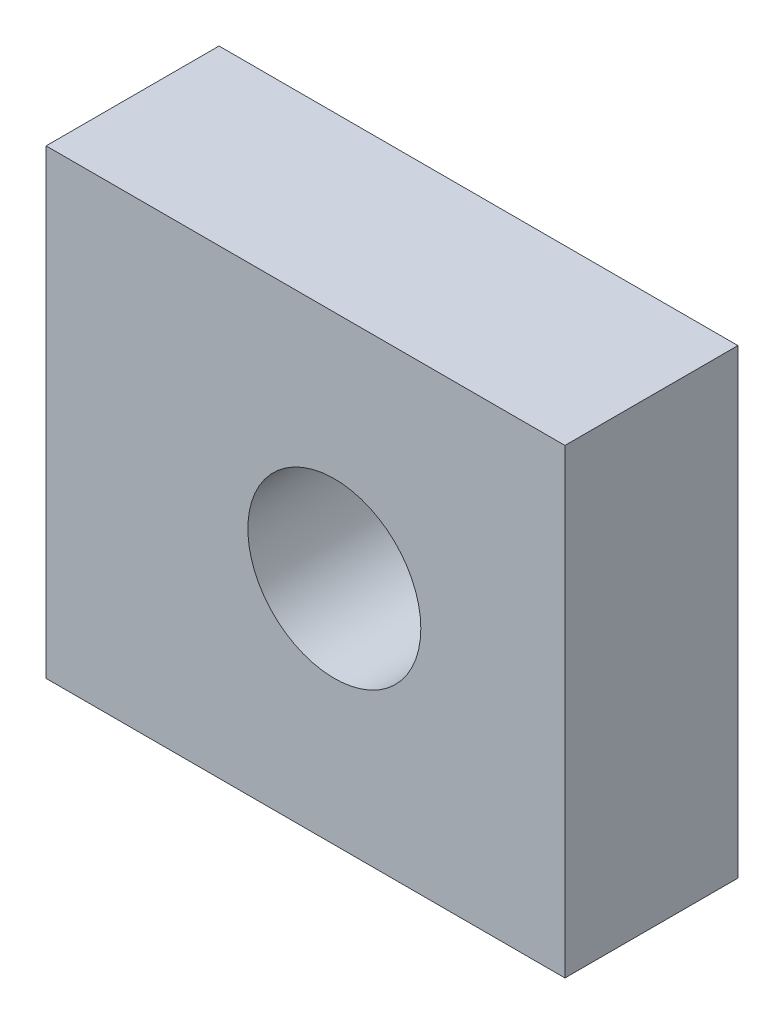
ISO-10303-21;
HEADER;
FILE_DESCRIPTION(('STEP AP214'),'2;1');
FILE_NAME('part.step','',(''),(''),'','','');
FILE_SCHEMA(('AUTOMOTIVE_DESIGN { 1 0 10303 214 1 1 1 1 }'));
ENDSEC;
DATA;
#1=APPLICATION_CONTEXT('core data for automotive mechanical design processes');
#2=APPLICATION_PROTOCOL_DEFINITION('international standard','automotive_design',2000,#1);
#3=PRODUCT_CONTEXT('',#1,'mechanical');
#4=PRODUCT('Part','Part','',(#3));
#5=PRODUCT_RELATED_PRODUCT_CATEGORY('part','',(#4));
#6=PRODUCT_DEFINITION_FORMATION('','',#4);
#7=PRODUCT_DEFINITION_CONTEXT('part definition',#1,'design');
#8=PRODUCT_DEFINITION('design','',#6,#7);
#9=PRODUCT_DEFINITION_SHAPE('','',#8);
#10=(LENGTH_UNIT() NAMED_UNIT(*) SI_UNIT(.MILLI.,.METRE.));
#11=(NAMED_UNIT(*) PLANE_ANGLE_UNIT() SI_UNIT($,.RADIAN.));
#12=(NAMED_UNIT(*) SI_UNIT($,.STERADIAN.) SOLID_ANGLE_UNIT());
#13=UNCERTAINTY_MEASURE_WITH_UNIT(LENGTH_MEASURE(1.E-05),#10,'distance_accuracy_value','');
#14=(GEOMETRIC_REPRESENTATION_CONTEXT(3) GLOBAL_UNCERTAINTY_ASSIGNED_CONTEXT((#13)) GLOBAL_UNIT_ASSIGNED_CONTEXT((#10,
#11,#12)) REPRESENTATION_CONTEXT('',''));
#15=CARTESIAN_POINT('',(0.,0.,0.));
#16=DIRECTION('',(0.,0.,1.));
#17=DIRECTION('',(1.,0.,0.));
#18=AXIS2_PLACEMENT_3D('',#15,#16,#17);
#19=CARTESIAN_POINT('',(0.,0.,3.));
#20=DIRECTION('',(1.,0.,0.));
#21=DIRECTION('',(0.,1.,0.));
#22=AXIS2_PLACEMENT_3D('',#19,#20,#21);
#23=PLANE('',#22);
#24=DIRECTION('',(0.,-1.,0.));
#25=VECTOR('',#24,1.);
#26=CARTESIAN_POINT('',(0.,0.,0.));
#27=LINE('',#26,#25);
#28=CARTESIAN_POINT('',(0.,8.,0.));
#29=VERTEX_POINT('',#28);
#30=CARTESIAN_POINT('',(0.,0.,0.));
#31=VERTEX_POINT('',#30);
#32=EDGE_CURVE('E98',#29,#31,#27,.T.);
#33=ORIENTED_EDGE('',*,*,#32,.T.);
#34=DIRECTION('',(0.,0.,-1.));
#35=VECTOR('',#34,1.);
#36=CARTESIAN_POINT('',(0.,0.,3.));
#37=LINE('',#36,#35);
#38=CARTESIAN_POINT('',(0.,0.,3.));
#39=VERTEX_POINT('',#38);
#40=EDGE_CURVE('E11',#39,#31,#37,.T.);
#41=ORIENTED_EDGE('',*,*,#40,.F.);
#42=DIRECTION('',(0.,-1.,0.));
#43=VECTOR('',#42,1.);
#44=CARTESIAN_POINT('',(0.,0.,3.));
#45=LINE('',#44,#43);
#46=CARTESIAN_POINT('',(0.,8.,3.));
#47=VERTEX_POINT('',#46);
#48=EDGE_CURVE('E86',#47,#39,#45,.T.);
#49=ORIENTED_EDGE('',*,*,#48,.F.);
#50=DIRECTION('',(0.,0.,-1.));
#51=VECTOR('',#50,1.);
#52=CARTESIAN_POINT('',(0.,8.,3.));
#53=LINE('',#52,#51);
#54=EDGE_CURVE('E94',#47,#29,#53,.T.);
#55=ORIENTED_EDGE('',*,*,#54,.T.);
#56=EDGE_LOOP('',(#33,#41,#49,#55));
#57=FACE_BOUND('',#56,.T.);
#58=ADVANCED_FACE('F35',(#57),#23,.F.);
#59=CARTESIAN_POINT('',(0.,0.,3.));
#60=DIRECTION('',(0.,1.,0.));
#61=DIRECTION('',(-1.,0.,0.));
#62=AXIS2_PLACEMENT_3D('',#59,#60,#61);
#63=PLANE('',#62);
#64=DIRECTION('',(1.,0.,0.));
#65=VECTOR('',#64,1.);
#66=CARTESIAN_POINT('',(0.,0.,0.));
#67=LINE('',#66,#65);
#68=CARTESIAN_POINT('',(9.,0.,0.));
#69=VERTEX_POINT('',#68);
#70=EDGE_CURVE('E90',#31,#69,#67,.T.);
#71=ORIENTED_EDGE('',*,*,#70,.T.);
#72=DIRECTION('',(0.,0.,-1.));
#73=VECTOR('',#72,1.);
#74=CARTESIAN_POINT('',(9.,0.,3.));
#75=LINE('',#74,#73);
#76=CARTESIAN_POINT('',(9.,0.,3.));
#77=VERTEX_POINT('',#76);
#78=EDGE_CURVE('E43',#77,#69,#75,.T.);
#79=ORIENTED_EDGE('',*,*,#78,.F.);
#80=DIRECTION('',(1.,0.,0.));
#81=VECTOR('',#80,1.);
#82=CARTESIAN_POINT('',(0.,0.,3.));
#83=LINE('',#82,#81);
#84=EDGE_CURVE('E81',#39,#77,#83,.T.);
#85=ORIENTED_EDGE('',*,*,#84,.F.);
#86=ORIENTED_EDGE('',*,*,#40,.T.);
#87=EDGE_LOOP('',(#71,#79,#85,#86));
#88=FACE_BOUND('',#87,.T.);
#89=ADVANCED_FACE('F89',(#88),#63,.F.);
#90=CARTESIAN_POINT('',(9.,0.,3.));
#91=DIRECTION('',(-1.,0.,0.));
#92=DIRECTION('',(0.,-1.,0.));
#93=AXIS2_PLACEMENT_3D('',#90,#91,#92);
#94=PLANE('',#93);
#95=DIRECTION('',(0.,1.,0.));
#96=VECTOR('',#95,1.);
#97=CARTESIAN_POINT('',(9.,0.,0.));
#98=LINE('',#97,#96);
#99=CARTESIAN_POINT('',(9.,8.,0.));
#100=VERTEX_POINT('',#99);
#101=EDGE_CURVE('E68',#69,#100,#98,.T.);
#102=ORIENTED_EDGE('',*,*,#101,.T.);
#103=DIRECTION('',(0.,0.,-1.));
#104=VECTOR('',#103,1.);
#105=CARTESIAN_POINT('',(9.,8.,3.));
#106=LINE('',#105,#104);
#107=CARTESIAN_POINT('',(9.,8.,3.));
#108=VERTEX_POINT('',#107);
#109=EDGE_CURVE('E91',#108,#100,#106,.T.);
#110=ORIENTED_EDGE('',*,*,#109,.F.);
#111=DIRECTION('',(0.,1.,0.));
#112=VECTOR('',#111,1.);
#113=CARTESIAN_POINT('',(9.,0.,3.));
#114=LINE('',#113,#112);
#115=EDGE_CURVE('E84',#77,#108,#114,.T.);
#116=ORIENTED_EDGE('',*,*,#115,.F.);
#117=ORIENTED_EDGE('',*,*,#78,.T.);
#118=EDGE_LOOP('',(#102,#110,#116,#117));
#119=FACE_BOUND('',#118,.T.);
#120=ADVANCED_FACE('F92',(#119),#94,.F.);
#121=CARTESIAN_POINT('',(0.,8.,3.));
#122=DIRECTION('',(0.,-1.,0.));
#123=DIRECTION('',(1.,0.,0.));
#124=AXIS2_PLACEMENT_3D('',#121,#122,#123);
#125=PLANE('',#124);
#126=DIRECTION('',(-1.,0.,0.));
#127=VECTOR('',#126,1.);
#128=CARTESIAN_POINT('',(0.,8.,0.));
#129=LINE('',#128,#127);
#130=EDGE_CURVE('E74',#100,#29,#129,.T.);
#131=ORIENTED_EDGE('',*,*,#130,.T.);
#132=ORIENTED_EDGE('',*,*,#54,.F.);
#133=DIRECTION('',(-1.,0.,0.));
#134=VECTOR('',#133,1.);
#135=CARTESIAN_POINT('',(0.,8.,3.));
#136=LINE('',#135,#134);
#137=EDGE_CURVE('E51',#108,#47,#136,.T.);
#138=ORIENTED_EDGE('',*,*,#137,.F.);
#139=ORIENTED_EDGE('',*,*,#109,.T.);
#140=EDGE_LOOP('',(#131,#132,#138,#139));
#141=FACE_BOUND('',#140,.T.);
#142=ADVANCED_FACE('F106',(#141),#125,.F.);
#143=CARTESIAN_POINT('',(0.,0.,3.));
#144=DIRECTION('',(0.,0.,-1.));
#145=DIRECTION('',(-1.,0.,0.));
#146=AXIS2_PLACEMENT_3D('',#143,#144,#145);
#147=PLANE('',#146);
#148=CARTESIAN_POINT('',(5.,4.,3.));
#149=DIRECTION('',(0.,0.,1.));
#150=DIRECTION('',(1.,0.,0.));
#151=AXIS2_PLACEMENT_3D('',#148,#149,#150);
#152=CIRCLE('',#151,1.5);
#153=CARTESIAN_POINT('',(6.5,4.,3.));
#154=VERTEX_POINT('',#153);
#155=EDGE_CURVE('E112',#154,#154,#152,.T.);
#156=ORIENTED_EDGE('',*,*,#155,.F.);
#157=EDGE_LOOP('',(#156));
#158=FACE_BOUND('',#157,.T.);
#159=ORIENTED_EDGE('',*,*,#48,.T.);
#160=ORIENTED_EDGE('',*,*,#84,.T.);
#161=ORIENTED_EDGE('',*,*,#115,.T.);
#162=ORIENTED_EDGE('',*,*,#137,.T.);
#163=EDGE_LOOP('',(#159,#160,#161,#162));
#164=FACE_BOUND('',#163,.T.);
#165=ADVANCED_FACE('F82',(#158,#164),#147,.F.);
#166=CARTESIAN_POINT('',(0.,0.,0.));
#167=DIRECTION('',(0.,0.,-1.));
#168=DIRECTION('',(-1.,0.,0.));
#169=AXIS2_PLACEMENT_3D('',#166,#167,#168);
#170=PLANE('',#169);
#171=CARTESIAN_POINT('',(5.,4.,0.));
#172=DIRECTION('',(0.,0.,1.));
#173=DIRECTION('',(1.,0.,0.));
#174=AXIS2_PLACEMENT_3D('',#171,#172,#173);
#175=CIRCLE('',#174,1.5);
#176=CARTESIAN_POINT('',(6.5,4.,0.));
#177=VERTEX_POINT('',#176);
#178=EDGE_CURVE('E101',#177,#177,#175,.T.);
#179=ORIENTED_EDGE('',*,*,#178,.T.);
#180=EDGE_LOOP('',(#179));
#181=FACE_BOUND('',#180,.T.);
#182=ORIENTED_EDGE('',*,*,#32,.F.);
#183=ORIENTED_EDGE('',*,*,#130,.F.);
#184=ORIENTED_EDGE('',*,*,#101,.F.);
#185=ORIENTED_EDGE('',*,*,#70,.F.);
#186=EDGE_LOOP('',(#182,#183,#184,#185));
#187=FACE_BOUND('',#186,.T.);
#188=ADVANCED_FACE('F109',(#181,#187),#170,.T.);
#189=CARTESIAN_POINT('',(5.,4.,0.));
#190=DIRECTION('',(0.,0.,1.));
#191=DIRECTION('',(1.,0.,0.));
#192=AXIS2_PLACEMENT_3D('',#189,#190,#191);
#193=CYLINDRICAL_SURFACE('',#192,1.5);
#194=ORIENTED_EDGE('',*,*,#178,.F.);
#195=EDGE_LOOP('',(#194));
#196=FACE_BOUND('',#195,.T.);
#197=ORIENTED_EDGE('',*,*,#155,.T.);
#198=EDGE_LOOP('',(#197));
#199=FACE_BOUND('',#198,.T.);
#200=ADVANCED_FACE('F119',(#196,#199),#193,.F.);
#201=CLOSED_SHELL('',(#58,#89,#120,#142,#165,#188,#200));
#202=MANIFOLD_SOLID_BREP('B2',#201);
#203=ADVANCED_BREP_SHAPE_REPRESENTATION('',(#18,#202),#14);
#204=SHAPE_DEFINITION_REPRESENTATION(#9,#203);
ENDSEC;
END-ISO-10303-21;
